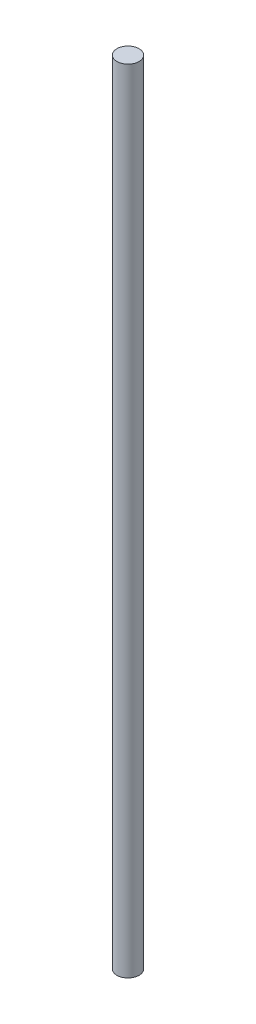
ISO-10303-21;
HEADER;
FILE_DESCRIPTION(('STEP AP214'),'2;1');
FILE_NAME('part.step','',(''),(''),'','','');
FILE_SCHEMA(('AUTOMOTIVE_DESIGN { 1 0 10303 214 1 1 1 1 }'));
ENDSEC;
DATA;
#1=APPLICATION_CONTEXT('core data for automotive mechanical design processes');
#2=APPLICATION_PROTOCOL_DEFINITION('international standard','automotive_design',2000,#1);
#3=PRODUCT_CONTEXT('',#1,'mechanical');
#4=PRODUCT('Part','Part','',(#3));
#5=PRODUCT_RELATED_PRODUCT_CATEGORY('part','',(#4));
#6=PRODUCT_DEFINITION_FORMATION('','',#4);
#7=PRODUCT_DEFINITION_CONTEXT('part definition',#1,'design');
#8=PRODUCT_DEFINITION('design','',#6,#7);
#9=PRODUCT_DEFINITION_SHAPE('','',#8);
#10=(LENGTH_UNIT() NAMED_UNIT(*) SI_UNIT(.MILLI.,.METRE.));
#11=(NAMED_UNIT(*) PLANE_ANGLE_UNIT() SI_UNIT($,.RADIAN.));
#12=(NAMED_UNIT(*) SI_UNIT($,.STERADIAN.) SOLID_ANGLE_UNIT());
#13=UNCERTAINTY_MEASURE_WITH_UNIT(LENGTH_MEASURE(1.E-05),#10,'distance_accuracy_value','');
#14=(GEOMETRIC_REPRESENTATION_CONTEXT(3) GLOBAL_UNCERTAINTY_ASSIGNED_CONTEXT((#13)) GLOBAL_UNIT_ASSIGNED_CONTEXT((#10,
#11,#12)) REPRESENTATION_CONTEXT('',''));
#15=CARTESIAN_POINT('',(0.,0.,0.));
#16=DIRECTION('',(0.,0.,1.));
#17=DIRECTION('',(1.,0.,0.));
#18=AXIS2_PLACEMENT_3D('',#15,#16,#17);
#19=CARTESIAN_POINT('',(0.,285.,0.));
#20=DIRECTION('',(0.,-1.,0.));
#21=DIRECTION('',(0.,0.,-1.));
#22=AXIS2_PLACEMENT_3D('',#19,#20,#21);
#23=CYLINDRICAL_SURFACE('',#22,4.);
#24=CARTESIAN_POINT('',(0.,285.,0.));
#25=DIRECTION('',(0.,1.,0.));
#26=DIRECTION('',(0.,0.,1.));
#27=AXIS2_PLACEMENT_3D('',#24,#25,#26);
#28=CIRCLE('',#27,4.);
#29=CARTESIAN_POINT('',(0.,285.,4.));
#30=VERTEX_POINT('',#29);
#31=EDGE_CURVE('E10',#30,#30,#28,.T.);
#32=ORIENTED_EDGE('',*,*,#31,.F.);
#33=EDGE_LOOP('',(#32));
#34=FACE_BOUND('',#33,.T.);
#35=CARTESIAN_POINT('',(0.,0.,0.));
#36=DIRECTION('',(0.,1.,0.));
#37=DIRECTION('',(0.,0.,1.));
#38=AXIS2_PLACEMENT_3D('',#35,#36,#37);
#39=CIRCLE('',#38,4.);
#40=CARTESIAN_POINT('',(0.,0.,4.));
#41=VERTEX_POINT('',#40);
#42=EDGE_CURVE('E40',#41,#41,#39,.T.);
#43=ORIENTED_EDGE('',*,*,#42,.T.);
#44=EDGE_LOOP('',(#43));
#45=FACE_BOUND('',#44,.T.);
#46=ADVANCED_FACE('F37',(#34,#45),#23,.T.);
#47=CARTESIAN_POINT('',(0.,285.,0.));
#48=DIRECTION('',(0.,1.,0.));
#49=DIRECTION('',(0.,0.,1.));
#50=AXIS2_PLACEMENT_3D('',#47,#48,#49);
#51=PLANE('',#50);
#52=ORIENTED_EDGE('',*,*,#31,.T.);
#53=EDGE_LOOP('',(#52));
#54=FACE_BOUND('',#53,.T.);
#55=ADVANCED_FACE('F54',(#54),#51,.T.);
#56=CARTESIAN_POINT('',(0.,0.,0.));
#57=DIRECTION('',(0.,1.,0.));
#58=DIRECTION('',(0.,0.,1.));
#59=AXIS2_PLACEMENT_3D('',#56,#57,#58);
#60=PLANE('',#59);
#61=ORIENTED_EDGE('',*,*,#42,.F.);
#62=EDGE_LOOP('',(#61));
#63=FACE_BOUND('',#62,.T.);
#64=ADVANCED_FACE('F52',(#63),#60,.F.);
#65=CLOSED_SHELL('',(#46,#55,#64));
#66=MANIFOLD_SOLID_BREP('B2',#65);
#67=ADVANCED_BREP_SHAPE_REPRESENTATION('',(#18,#66),#14);
#68=SHAPE_DEFINITION_REPRESENTATION(#9,#67);
ENDSEC;
END-ISO-10303-21;
